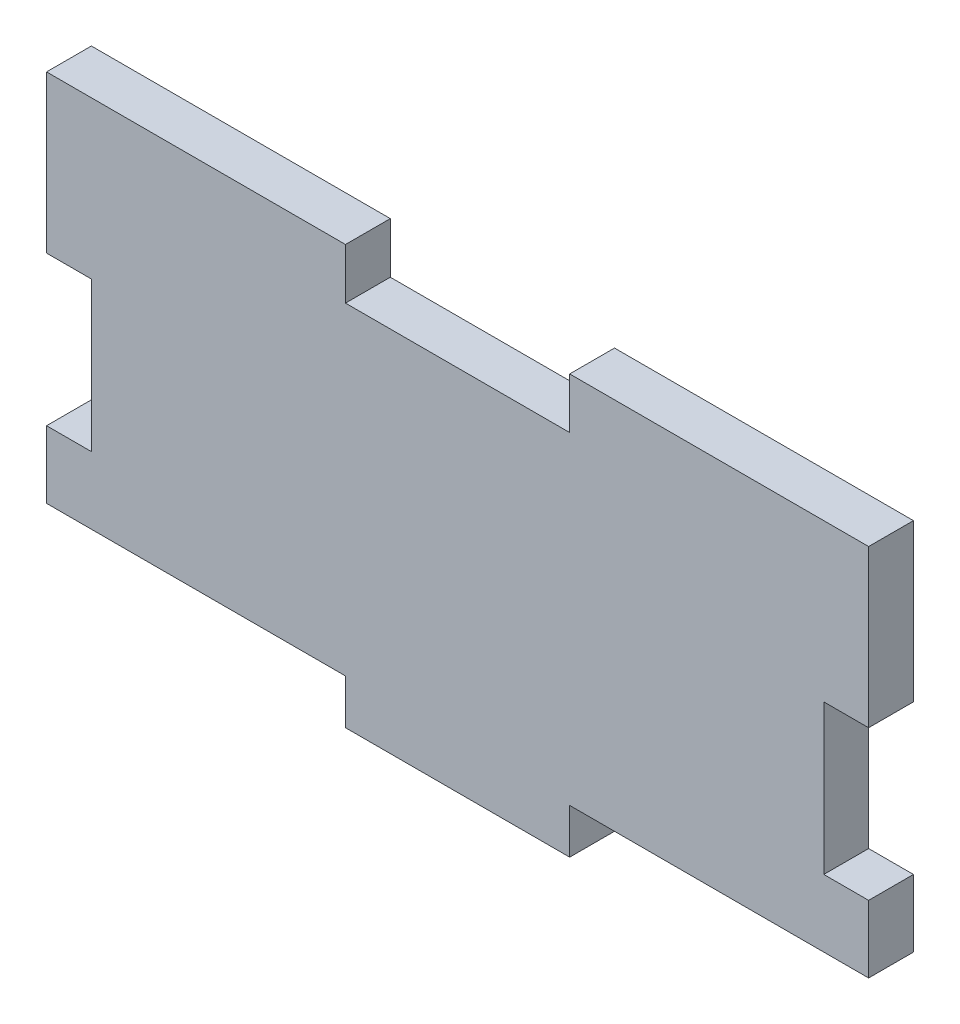
ISO-10303-21;
HEADER;
FILE_DESCRIPTION(('STEP AP214'),'2;1');
FILE_NAME('part.step','',(''),(''),'','','');
FILE_SCHEMA(('AUTOMOTIVE_DESIGN { 1 0 10303 214 1 1 1 1 }'));
ENDSEC;
DATA;
#1=APPLICATION_CONTEXT('core data for automotive mechanical design processes');
#2=APPLICATION_PROTOCOL_DEFINITION('international standard','automotive_design',2000,#1);
#3=PRODUCT_CONTEXT('',#1,'mechanical');
#4=PRODUCT('Part','Part','',(#3));
#5=PRODUCT_RELATED_PRODUCT_CATEGORY('part','',(#4));
#6=PRODUCT_DEFINITION_FORMATION('','',#4);
#7=PRODUCT_DEFINITION_CONTEXT('part definition',#1,'design');
#8=PRODUCT_DEFINITION('design','',#6,#7);
#9=PRODUCT_DEFINITION_SHAPE('','',#8);
#10=(LENGTH_UNIT() NAMED_UNIT(*) SI_UNIT(.MILLI.,.METRE.));
#11=(NAMED_UNIT(*) PLANE_ANGLE_UNIT() SI_UNIT($,.RADIAN.));
#12=(NAMED_UNIT(*) SI_UNIT($,.STERADIAN.) SOLID_ANGLE_UNIT());
#13=UNCERTAINTY_MEASURE_WITH_UNIT(LENGTH_MEASURE(1.E-05),#10,'distance_accuracy_value','');
#14=(GEOMETRIC_REPRESENTATION_CONTEXT(3) GLOBAL_UNCERTAINTY_ASSIGNED_CONTEXT((#13)) GLOBAL_UNIT_ASSIGNED_CONTEXT((#10,
#11,#12)) REPRESENTATION_CONTEXT('',''));
#15=CARTESIAN_POINT('',(0.,0.,0.));
#16=DIRECTION('',(0.,0.,1.));
#17=DIRECTION('',(1.,0.,0.));
#18=AXIS2_PLACEMENT_3D('',#15,#16,#17);
#19=CARTESIAN_POINT('',(0.,0.,-226.));
#20=DIRECTION('',(0.,1.,0.));
#21=DIRECTION('',(0.,0.,1.));
#22=AXIS2_PLACEMENT_3D('',#19,#20,#21);
#23=PLANE('',#22);
#24=DIRECTION('',(-1.,0.,0.));
#25=VECTOR('',#24,1.);
#26=CARTESIAN_POINT('',(0.,0.,-223.));
#27=LINE('',#26,#25);
#28=CARTESIAN_POINT('',(7.5,0.,-223.));
#29=VERTEX_POINT('',#28);
#30=CARTESIAN_POINT('',(-7.5,0.,-223.));
#31=VERTEX_POINT('',#30);
#32=EDGE_CURVE('E120',#29,#31,#27,.T.);
#33=ORIENTED_EDGE('',*,*,#32,.T.);
#34=DIRECTION('',(0.,0.,1.));
#35=VECTOR('',#34,1.);
#36=CARTESIAN_POINT('',(-7.5,0.,-226.));
#37=LINE('',#36,#35);
#38=CARTESIAN_POINT('',(-7.5,0.,-226.));
#39=VERTEX_POINT('',#38);
#40=EDGE_CURVE('E11',#39,#31,#37,.T.);
#41=ORIENTED_EDGE('',*,*,#40,.F.);
#42=DIRECTION('',(-1.,0.,0.));
#43=VECTOR('',#42,1.);
#44=CARTESIAN_POINT('',(0.,0.,-226.));
#45=LINE('',#44,#43);
#46=CARTESIAN_POINT('',(7.5,0.,-226.));
#47=VERTEX_POINT('',#46);
#48=EDGE_CURVE('E126',#47,#39,#45,.T.);
#49=ORIENTED_EDGE('',*,*,#48,.F.);
#50=DIRECTION('',(0.,0.,1.));
#51=VECTOR('',#50,1.);
#52=CARTESIAN_POINT('',(7.5,0.,-226.));
#53=LINE('',#52,#51);
#54=EDGE_CURVE('E196',#47,#29,#53,.T.);
#55=ORIENTED_EDGE('',*,*,#54,.T.);
#56=EDGE_LOOP('',(#33,#41,#49,#55));
#57=FACE_BOUND('',#56,.T.);
#58=ADVANCED_FACE('F32',(#57),#23,.F.);
#59=CARTESIAN_POINT('',(-7.5,0.,-226.));
#60=DIRECTION('',(1.,0.,0.));
#61=DIRECTION('',(0.,0.,-1.));
#62=AXIS2_PLACEMENT_3D('',#59,#60,#61);
#63=PLANE('',#62);
#64=DIRECTION('',(0.,1.,0.));
#65=VECTOR('',#64,1.);
#66=CARTESIAN_POINT('',(-7.5,0.,-223.));
#67=LINE('',#66,#65);
#68=CARTESIAN_POINT('',(-7.5,3.,-223.));
#69=VERTEX_POINT('',#68);
#70=EDGE_CURVE('E201',#31,#69,#67,.T.);
#71=ORIENTED_EDGE('',*,*,#70,.T.);
#72=DIRECTION('',(0.,0.,1.));
#73=VECTOR('',#72,1.);
#74=CARTESIAN_POINT('',(-7.5,3.,-226.));
#75=LINE('',#74,#73);
#76=CARTESIAN_POINT('',(-7.5,3.,-226.));
#77=VERTEX_POINT('',#76);
#78=EDGE_CURVE('E40',#77,#69,#75,.T.);
#79=ORIENTED_EDGE('',*,*,#78,.F.);
#80=DIRECTION('',(0.,1.,0.));
#81=VECTOR('',#80,1.);
#82=CARTESIAN_POINT('',(-7.5,0.,-226.));
#83=LINE('',#82,#81);
#84=EDGE_CURVE('E294',#39,#77,#83,.T.);
#85=ORIENTED_EDGE('',*,*,#84,.F.);
#86=ORIENTED_EDGE('',*,*,#40,.T.);
#87=EDGE_LOOP('',(#71,#79,#85,#86));
#88=FACE_BOUND('',#87,.T.);
#89=ADVANCED_FACE('F293',(#88),#63,.F.);
#90=CARTESIAN_POINT('',(-24.5,3.,-226.));
#91=DIRECTION('',(0.,1.,0.));
#92=DIRECTION('',(0.,0.,1.));
#93=AXIS2_PLACEMENT_3D('',#90,#91,#92);
#94=PLANE('',#93);
#95=DIRECTION('',(-1.,0.,0.));
#96=VECTOR('',#95,1.);
#97=CARTESIAN_POINT('',(-24.5,3.,-223.));
#98=LINE('',#97,#96);
#99=CARTESIAN_POINT('',(-27.5,3.,-223.));
#100=VERTEX_POINT('',#99);
#101=EDGE_CURVE('E204',#69,#100,#98,.T.);
#102=ORIENTED_EDGE('',*,*,#101,.T.);
#103=DIRECTION('',(0.,0.,1.));
#104=VECTOR('',#103,1.);
#105=CARTESIAN_POINT('',(-27.5,3.,-226.));
#106=LINE('',#105,#104);
#107=CARTESIAN_POINT('',(-27.5,3.,-226.));
#108=VERTEX_POINT('',#107);
#109=EDGE_CURVE('E282',#108,#100,#106,.T.);
#110=ORIENTED_EDGE('',*,*,#109,.F.);
#111=DIRECTION('',(-1.,0.,0.));
#112=VECTOR('',#111,1.);
#113=CARTESIAN_POINT('',(-7.5,3.,-226.));
#114=LINE('',#113,#112);
#115=EDGE_CURVE('E290',#77,#108,#114,.T.);
#116=ORIENTED_EDGE('',*,*,#115,.F.);
#117=ORIENTED_EDGE('',*,*,#78,.T.);
#118=EDGE_LOOP('',(#102,#110,#116,#117));
#119=FACE_BOUND('',#118,.T.);
#120=ADVANCED_FACE('F288',(#119),#94,.F.);
#121=CARTESIAN_POINT('',(-27.5,3.,-226.));
#122=DIRECTION('',(1.,0.,0.));
#123=DIRECTION('',(0.,0.,-1.));
#124=AXIS2_PLACEMENT_3D('',#121,#122,#123);
#125=PLANE('',#124);
#126=DIRECTION('',(0.,1.,0.));
#127=VECTOR('',#126,1.);
#128=CARTESIAN_POINT('',(-27.5,3.,-223.));
#129=LINE('',#128,#127);
#130=CARTESIAN_POINT('',(-27.5,7.5,-223.));
#131=VERTEX_POINT('',#130);
#132=EDGE_CURVE('E206',#100,#131,#129,.T.);
#133=ORIENTED_EDGE('',*,*,#132,.T.);
#134=DIRECTION('',(0.,0.,1.));
#135=VECTOR('',#134,1.);
#136=CARTESIAN_POINT('',(-27.5,7.5,-226.));
#137=LINE('',#136,#135);
#138=CARTESIAN_POINT('',(-27.5,7.5,-226.));
#139=VERTEX_POINT('',#138);
#140=EDGE_CURVE('E279',#139,#131,#137,.T.);
#141=ORIENTED_EDGE('',*,*,#140,.F.);
#142=DIRECTION('',(0.,1.,0.));
#143=VECTOR('',#142,1.);
#144=CARTESIAN_POINT('',(-27.5,3.,-226.));
#145=LINE('',#144,#143);
#146=EDGE_CURVE('E310',#108,#139,#145,.T.);
#147=ORIENTED_EDGE('',*,*,#146,.F.);
#148=ORIENTED_EDGE('',*,*,#109,.T.);
#149=EDGE_LOOP('',(#133,#141,#147,#148));
#150=FACE_BOUND('',#149,.T.);
#151=ADVANCED_FACE('F301',(#150),#125,.F.);
#152=CARTESIAN_POINT('',(-24.5,7.5,-226.));
#153=DIRECTION('',(0.,-1.,0.));
#154=DIRECTION('',(0.,0.,-1.));
#155=AXIS2_PLACEMENT_3D('',#152,#153,#154);
#156=PLANE('',#155);
#157=DIRECTION('',(1.,0.,0.));
#158=VECTOR('',#157,1.);
#159=CARTESIAN_POINT('',(-24.5,7.5,-223.));
#160=LINE('',#159,#158);
#161=CARTESIAN_POINT('',(-24.5,7.5,-223.));
#162=VERTEX_POINT('',#161);
#163=EDGE_CURVE('E208',#131,#162,#160,.T.);
#164=ORIENTED_EDGE('',*,*,#163,.T.);
#165=DIRECTION('',(0.,0.,1.));
#166=VECTOR('',#165,1.);
#167=CARTESIAN_POINT('',(-24.5,7.5,-226.));
#168=LINE('',#167,#166);
#169=CARTESIAN_POINT('',(-24.5,7.5,-226.));
#170=VERTEX_POINT('',#169);
#171=EDGE_CURVE('E276',#170,#162,#168,.T.);
#172=ORIENTED_EDGE('',*,*,#171,.F.);
#173=DIRECTION('',(1.,0.,0.));
#174=VECTOR('',#173,1.);
#175=CARTESIAN_POINT('',(-24.5,7.5,-226.));
#176=LINE('',#175,#174);
#177=EDGE_CURVE('E307',#139,#170,#176,.T.);
#178=ORIENTED_EDGE('',*,*,#177,.F.);
#179=ORIENTED_EDGE('',*,*,#140,.T.);
#180=EDGE_LOOP('',(#164,#172,#178,#179));
#181=FACE_BOUND('',#180,.T.);
#182=ADVANCED_FACE('F305',(#181),#156,.F.);
#183=CARTESIAN_POINT('',(-24.5,17.5,-226.));
#184=DIRECTION('',(1.,0.,0.));
#185=DIRECTION('',(0.,0.,-1.));
#186=AXIS2_PLACEMENT_3D('',#183,#184,#185);
#187=PLANE('',#186);
#188=DIRECTION('',(0.,1.,0.));
#189=VECTOR('',#188,1.);
#190=CARTESIAN_POINT('',(-24.5,17.5,-223.));
#191=LINE('',#190,#189);
#192=CARTESIAN_POINT('',(-24.5,17.5,-223.));
#193=VERTEX_POINT('',#192);
#194=EDGE_CURVE('E210',#162,#193,#191,.T.);
#195=ORIENTED_EDGE('',*,*,#194,.T.);
#196=DIRECTION('',(0.,0.,1.));
#197=VECTOR('',#196,1.);
#198=CARTESIAN_POINT('',(-24.5,17.5,-226.));
#199=LINE('',#198,#197);
#200=CARTESIAN_POINT('',(-24.5,17.5,-226.));
#201=VERTEX_POINT('',#200);
#202=EDGE_CURVE('E273',#201,#193,#199,.T.);
#203=ORIENTED_EDGE('',*,*,#202,.F.);
#204=DIRECTION('',(0.,1.,0.));
#205=VECTOR('',#204,1.);
#206=CARTESIAN_POINT('',(-24.5,17.5,-226.));
#207=LINE('',#206,#205);
#208=EDGE_CURVE('E309',#170,#201,#207,.T.);
#209=ORIENTED_EDGE('',*,*,#208,.F.);
#210=ORIENTED_EDGE('',*,*,#171,.T.);
#211=EDGE_LOOP('',(#195,#203,#209,#210));
#212=FACE_BOUND('',#211,.T.);
#213=ADVANCED_FACE('F363',(#212),#187,.F.);
#214=CARTESIAN_POINT('',(-27.5,17.5,-226.));
#215=DIRECTION('',(0.,1.,0.));
#216=DIRECTION('',(0.,0.,1.));
#217=AXIS2_PLACEMENT_3D('',#214,#215,#216);
#218=PLANE('',#217);
#219=DIRECTION('',(-1.,0.,0.));
#220=VECTOR('',#219,1.);
#221=CARTESIAN_POINT('',(-27.5,17.5,-223.));
#222=LINE('',#221,#220);
#223=CARTESIAN_POINT('',(-27.5,17.5,-223.));
#224=VERTEX_POINT('',#223);
#225=EDGE_CURVE('E212',#193,#224,#222,.T.);
#226=ORIENTED_EDGE('',*,*,#225,.T.);
#227=DIRECTION('',(0.,0.,1.));
#228=VECTOR('',#227,1.);
#229=CARTESIAN_POINT('',(-27.5,17.5,-226.));
#230=LINE('',#229,#228);
#231=CARTESIAN_POINT('',(-27.5,17.5,-226.));
#232=VERTEX_POINT('',#231);
#233=EDGE_CURVE('E270',#232,#224,#230,.T.);
#234=ORIENTED_EDGE('',*,*,#233,.F.);
#235=DIRECTION('',(-1.,0.,0.));
#236=VECTOR('',#235,1.);
#237=CARTESIAN_POINT('',(-27.5,17.5,-226.));
#238=LINE('',#237,#236);
#239=EDGE_CURVE('E312',#201,#232,#238,.T.);
#240=ORIENTED_EDGE('',*,*,#239,.F.);
#241=ORIENTED_EDGE('',*,*,#202,.T.);
#242=EDGE_LOOP('',(#226,#234,#240,#241));
#243=FACE_BOUND('',#242,.T.);
#244=ADVANCED_FACE('F366',(#243),#218,.F.);
#245=CARTESIAN_POINT('',(-27.5,28.,-226.));
#246=DIRECTION('',(1.,0.,0.));
#247=DIRECTION('',(0.,0.,-1.));
#248=AXIS2_PLACEMENT_3D('',#245,#246,#247);
#249=PLANE('',#248);
#250=DIRECTION('',(0.,1.,0.));
#251=VECTOR('',#250,1.);
#252=CARTESIAN_POINT('',(-27.5,28.,-223.));
#253=LINE('',#252,#251);
#254=CARTESIAN_POINT('',(-27.5,28.,-223.));
#255=VERTEX_POINT('',#254);
#256=EDGE_CURVE('E214',#224,#255,#253,.T.);
#257=ORIENTED_EDGE('',*,*,#256,.T.);
#258=DIRECTION('',(0.,0.,1.));
#259=VECTOR('',#258,1.);
#260=CARTESIAN_POINT('',(-27.5,28.,-226.));
#261=LINE('',#260,#259);
#262=CARTESIAN_POINT('',(-27.5,28.,-226.));
#263=VERTEX_POINT('',#262);
#264=EDGE_CURVE('E267',#263,#255,#261,.T.);
#265=ORIENTED_EDGE('',*,*,#264,.F.);
#266=DIRECTION('',(0.,1.,0.));
#267=VECTOR('',#266,1.);
#268=CARTESIAN_POINT('',(-27.5,28.,-226.));
#269=LINE('',#268,#267);
#270=EDGE_CURVE('E318',#232,#263,#269,.T.);
#271=ORIENTED_EDGE('',*,*,#270,.F.);
#272=ORIENTED_EDGE('',*,*,#233,.T.);
#273=EDGE_LOOP('',(#257,#265,#271,#272));
#274=FACE_BOUND('',#273,.T.);
#275=ADVANCED_FACE('F370',(#274),#249,.F.);
#276=CARTESIAN_POINT('',(-7.5,28.,-226.));
#277=DIRECTION('',(0.,-1.,0.));
#278=DIRECTION('',(0.,0.,-1.));
#279=AXIS2_PLACEMENT_3D('',#276,#277,#278);
#280=PLANE('',#279);
#281=DIRECTION('',(1.,0.,0.));
#282=VECTOR('',#281,1.);
#283=CARTESIAN_POINT('',(-7.5,28.,-223.));
#284=LINE('',#283,#282);
#285=CARTESIAN_POINT('',(-7.5,28.,-223.));
#286=VERTEX_POINT('',#285);
#287=EDGE_CURVE('E217',#255,#286,#284,.T.);
#288=ORIENTED_EDGE('',*,*,#287,.T.);
#289=DIRECTION('',(0.,0.,1.));
#290=VECTOR('',#289,1.);
#291=CARTESIAN_POINT('',(-7.5,28.,-226.));
#292=LINE('',#291,#290);
#293=CARTESIAN_POINT('',(-7.5,28.,-226.));
#294=VERTEX_POINT('',#293);
#295=EDGE_CURVE('E264',#294,#286,#292,.T.);
#296=ORIENTED_EDGE('',*,*,#295,.F.);
#297=DIRECTION('',(1.,0.,0.));
#298=VECTOR('',#297,1.);
#299=CARTESIAN_POINT('',(-24.5,28.,-226.));
#300=LINE('',#299,#298);
#301=EDGE_CURVE('E320',#263,#294,#300,.T.);
#302=ORIENTED_EDGE('',*,*,#301,.F.);
#303=ORIENTED_EDGE('',*,*,#264,.T.);
#304=EDGE_LOOP('',(#288,#296,#302,#303));
#305=FACE_BOUND('',#304,.T.);
#306=ADVANCED_FACE('F374',(#305),#280,.F.);
#307=CARTESIAN_POINT('',(-7.5,28.,-226.));
#308=DIRECTION('',(-1.,0.,0.));
#309=DIRECTION('',(0.,0.,1.));
#310=AXIS2_PLACEMENT_3D('',#307,#308,#309);
#311=PLANE('',#310);
#312=DIRECTION('',(0.,-1.,0.));
#313=VECTOR('',#312,1.);
#314=CARTESIAN_POINT('',(-7.5,28.,-223.));
#315=LINE('',#314,#313);
#316=CARTESIAN_POINT('',(-7.5,24.6030038239068,-223.));
#317=VERTEX_POINT('',#316);
#318=EDGE_CURVE('E219',#286,#317,#315,.T.);
#319=ORIENTED_EDGE('',*,*,#318,.T.);
#320=DIRECTION('',(0.,0.,1.));
#321=VECTOR('',#320,1.);
#322=CARTESIAN_POINT('',(-7.5,24.6030038239068,-226.));
#323=LINE('',#322,#321);
#324=CARTESIAN_POINT('',(-7.5,24.6030038239068,-226.));
#325=VERTEX_POINT('',#324);
#326=EDGE_CURVE('E261',#325,#317,#323,.T.);
#327=ORIENTED_EDGE('',*,*,#326,.F.);
#328=DIRECTION('',(0.,-1.,0.));
#329=VECTOR('',#328,1.);
#330=CARTESIAN_POINT('',(-7.5,28.,-226.));
#331=LINE('',#330,#329);
#332=EDGE_CURVE('E322',#294,#325,#331,.T.);
#333=ORIENTED_EDGE('',*,*,#332,.F.);
#334=ORIENTED_EDGE('',*,*,#295,.T.);
#335=EDGE_LOOP('',(#319,#327,#333,#334));
#336=FACE_BOUND('',#335,.T.);
#337=ADVANCED_FACE('F378',(#336),#311,.F.);
#338=CARTESIAN_POINT('',(-7.5,24.6030038239068,-226.));
#339=DIRECTION('',(0.,-1.,0.));
#340=DIRECTION('',(1.,0.,0.));
#341=AXIS2_PLACEMENT_3D('',#338,#339,#340);
#342=PLANE('',#341);
#343=DIRECTION('',(1.,0.,0.));
#344=VECTOR('',#343,1.);
#345=CARTESIAN_POINT('',(-7.5,24.6030038239068,-223.));
#346=LINE('',#345,#344);
#347=CARTESIAN_POINT('',(7.5,24.6030038239068,-223.));
#348=VERTEX_POINT('',#347);
#349=EDGE_CURVE('E221',#317,#348,#346,.T.);
#350=ORIENTED_EDGE('',*,*,#349,.T.);
#351=DIRECTION('',(0.,0.,1.));
#352=VECTOR('',#351,1.);
#353=CARTESIAN_POINT('',(7.5,24.6030038239068,-226.));
#354=LINE('',#353,#352);
#355=CARTESIAN_POINT('',(7.5,24.6030038239068,-226.));
#356=VERTEX_POINT('',#355);
#357=EDGE_CURVE('E258',#356,#348,#354,.T.);
#358=ORIENTED_EDGE('',*,*,#357,.F.);
#359=DIRECTION('',(1.,0.,0.));
#360=VECTOR('',#359,1.);
#361=CARTESIAN_POINT('',(-7.5,24.6030038239068,-226.));
#362=LINE('',#361,#360);
#363=EDGE_CURVE('E324',#325,#356,#362,.T.);
#364=ORIENTED_EDGE('',*,*,#363,.F.);
#365=ORIENTED_EDGE('',*,*,#326,.T.);
#366=EDGE_LOOP('',(#350,#358,#364,#365));
#367=FACE_BOUND('',#366,.T.);
#368=ADVANCED_FACE('F382',(#367),#342,.F.);
#369=CARTESIAN_POINT('',(7.5,24.6030038239068,-226.));
#370=DIRECTION('',(1.,0.,0.));
#371=DIRECTION('',(0.,0.,-1.));
#372=AXIS2_PLACEMENT_3D('',#369,#370,#371);
#373=PLANE('',#372);
#374=DIRECTION('',(0.,1.,0.));
#375=VECTOR('',#374,1.);
#376=CARTESIAN_POINT('',(7.5,24.6030038239068,-223.));
#377=LINE('',#376,#375);
#378=CARTESIAN_POINT('',(7.5,28.,-223.));
#379=VERTEX_POINT('',#378);
#380=EDGE_CURVE('E223',#348,#379,#377,.T.);
#381=ORIENTED_EDGE('',*,*,#380,.T.);
#382=DIRECTION('',(0.,0.,1.));
#383=VECTOR('',#382,1.);
#384=CARTESIAN_POINT('',(7.5,28.,-226.));
#385=LINE('',#384,#383);
#386=CARTESIAN_POINT('',(7.5,28.,-226.));
#387=VERTEX_POINT('',#386);
#388=EDGE_CURVE('E255',#387,#379,#385,.T.);
#389=ORIENTED_EDGE('',*,*,#388,.F.);
#390=DIRECTION('',(0.,1.,0.));
#391=VECTOR('',#390,1.);
#392=CARTESIAN_POINT('',(7.5,24.6030038239068,-226.));
#393=LINE('',#392,#391);
#394=EDGE_CURVE('E326',#356,#387,#393,.T.);
#395=ORIENTED_EDGE('',*,*,#394,.F.);
#396=ORIENTED_EDGE('',*,*,#357,.T.);
#397=EDGE_LOOP('',(#381,#389,#395,#396));
#398=FACE_BOUND('',#397,.T.);
#399=ADVANCED_FACE('F386',(#398),#373,.F.);
#400=CARTESIAN_POINT('',(7.5,28.,-226.));
#401=DIRECTION('',(0.,-1.,0.));
#402=DIRECTION('',(1.,0.,0.));
#403=AXIS2_PLACEMENT_3D('',#400,#401,#402);
#404=PLANE('',#403);
#405=DIRECTION('',(1.,0.,0.));
#406=VECTOR('',#405,1.);
#407=CARTESIAN_POINT('',(7.5,28.,-223.));
#408=LINE('',#407,#406);
#409=CARTESIAN_POINT('',(27.5,28.,-223.));
#410=VERTEX_POINT('',#409);
#411=EDGE_CURVE('E225',#379,#410,#408,.T.);
#412=ORIENTED_EDGE('',*,*,#411,.T.);
#413=DIRECTION('',(0.,0.,1.));
#414=VECTOR('',#413,1.);
#415=CARTESIAN_POINT('',(27.5,28.,-226.));
#416=LINE('',#415,#414);
#417=CARTESIAN_POINT('',(27.5,28.,-226.));
#418=VERTEX_POINT('',#417);
#419=EDGE_CURVE('E252',#418,#410,#416,.T.);
#420=ORIENTED_EDGE('',*,*,#419,.F.);
#421=DIRECTION('',(1.,0.,0.));
#422=VECTOR('',#421,1.);
#423=CARTESIAN_POINT('',(7.5,28.,-226.));
#424=LINE('',#423,#422);
#425=EDGE_CURVE('E328',#387,#418,#424,.T.);
#426=ORIENTED_EDGE('',*,*,#425,.F.);
#427=ORIENTED_EDGE('',*,*,#388,.T.);
#428=EDGE_LOOP('',(#412,#420,#426,#427));
#429=FACE_BOUND('',#428,.T.);
#430=ADVANCED_FACE('F390',(#429),#404,.F.);
#431=CARTESIAN_POINT('',(27.5,28.,-226.));
#432=DIRECTION('',(-1.,0.,0.));
#433=DIRECTION('',(0.,0.,1.));
#434=AXIS2_PLACEMENT_3D('',#431,#432,#433);
#435=PLANE('',#434);
#436=DIRECTION('',(0.,-1.,0.));
#437=VECTOR('',#436,1.);
#438=CARTESIAN_POINT('',(27.5,28.,-223.));
#439=LINE('',#438,#437);
#440=CARTESIAN_POINT('',(27.5,17.5,-223.));
#441=VERTEX_POINT('',#440);
#442=EDGE_CURVE('E227',#410,#441,#439,.T.);
#443=ORIENTED_EDGE('',*,*,#442,.T.);
#444=DIRECTION('',(0.,0.,1.));
#445=VECTOR('',#444,1.);
#446=CARTESIAN_POINT('',(27.5,17.5,-226.));
#447=LINE('',#446,#445);
#448=CARTESIAN_POINT('',(27.5,17.5,-226.));
#449=VERTEX_POINT('',#448);
#450=EDGE_CURVE('E249',#449,#441,#447,.T.);
#451=ORIENTED_EDGE('',*,*,#450,.F.);
#452=DIRECTION('',(0.,-1.,0.));
#453=VECTOR('',#452,1.);
#454=CARTESIAN_POINT('',(27.5,28.,-226.));
#455=LINE('',#454,#453);
#456=EDGE_CURVE('E330',#418,#449,#455,.T.);
#457=ORIENTED_EDGE('',*,*,#456,.F.);
#458=ORIENTED_EDGE('',*,*,#419,.T.);
#459=EDGE_LOOP('',(#443,#451,#457,#458));
#460=FACE_BOUND('',#459,.T.);
#461=ADVANCED_FACE('F394',(#460),#435,.F.);
#462=CARTESIAN_POINT('',(27.5,17.5,-226.));
#463=DIRECTION('',(0.,1.,0.));
#464=DIRECTION('',(0.,0.,1.));
#465=AXIS2_PLACEMENT_3D('',#462,#463,#464);
#466=PLANE('',#465);
#467=DIRECTION('',(-1.,0.,0.));
#468=VECTOR('',#467,1.);
#469=CARTESIAN_POINT('',(27.5,17.5,-223.));
#470=LINE('',#469,#468);
#471=CARTESIAN_POINT('',(24.5,17.5,-223.));
#472=VERTEX_POINT('',#471);
#473=EDGE_CURVE('E229',#441,#472,#470,.T.);
#474=ORIENTED_EDGE('',*,*,#473,.T.);
#475=DIRECTION('',(0.,0.,1.));
#476=VECTOR('',#475,1.);
#477=CARTESIAN_POINT('',(24.5,17.5,-226.));
#478=LINE('',#477,#476);
#479=CARTESIAN_POINT('',(24.5,17.5,-226.));
#480=VERTEX_POINT('',#479);
#481=EDGE_CURVE('E246',#480,#472,#478,.T.);
#482=ORIENTED_EDGE('',*,*,#481,.F.);
#483=DIRECTION('',(-1.,0.,0.));
#484=VECTOR('',#483,1.);
#485=CARTESIAN_POINT('',(27.5,17.5,-226.));
#486=LINE('',#485,#484);
#487=EDGE_CURVE('E332',#449,#480,#486,.T.);
#488=ORIENTED_EDGE('',*,*,#487,.F.);
#489=ORIENTED_EDGE('',*,*,#450,.T.);
#490=EDGE_LOOP('',(#474,#482,#488,#489));
#491=FACE_BOUND('',#490,.T.);
#492=ADVANCED_FACE('F398',(#491),#466,.F.);
#493=CARTESIAN_POINT('',(24.5,17.5,-226.));
#494=DIRECTION('',(-1.,0.,0.));
#495=DIRECTION('',(0.,0.,1.));
#496=AXIS2_PLACEMENT_3D('',#493,#494,#495);
#497=PLANE('',#496);
#498=DIRECTION('',(0.,-1.,0.));
#499=VECTOR('',#498,1.);
#500=CARTESIAN_POINT('',(24.5,17.5,-223.));
#501=LINE('',#500,#499);
#502=CARTESIAN_POINT('',(24.5,7.5,-223.));
#503=VERTEX_POINT('',#502);
#504=EDGE_CURVE('E231',#472,#503,#501,.T.);
#505=ORIENTED_EDGE('',*,*,#504,.T.);
#506=DIRECTION('',(0.,0.,1.));
#507=VECTOR('',#506,1.);
#508=CARTESIAN_POINT('',(24.5,7.5,-226.));
#509=LINE('',#508,#507);
#510=CARTESIAN_POINT('',(24.5,7.5,-226.));
#511=VERTEX_POINT('',#510);
#512=EDGE_CURVE('E243',#511,#503,#509,.T.);
#513=ORIENTED_EDGE('',*,*,#512,.F.);
#514=DIRECTION('',(0.,-1.,0.));
#515=VECTOR('',#514,1.);
#516=CARTESIAN_POINT('',(24.5,17.5,-226.));
#517=LINE('',#516,#515);
#518=EDGE_CURVE('E334',#480,#511,#517,.T.);
#519=ORIENTED_EDGE('',*,*,#518,.F.);
#520=ORIENTED_EDGE('',*,*,#481,.T.);
#521=EDGE_LOOP('',(#505,#513,#519,#520));
#522=FACE_BOUND('',#521,.T.);
#523=ADVANCED_FACE('F340',(#522),#497,.F.);
#524=CARTESIAN_POINT('',(24.5,7.5,-226.));
#525=DIRECTION('',(0.,-1.,0.));
#526=DIRECTION('',(1.,0.,0.));
#527=AXIS2_PLACEMENT_3D('',#524,#525,#526);
#528=PLANE('',#527);
#529=DIRECTION('',(1.,0.,0.));
#530=VECTOR('',#529,1.);
#531=CARTESIAN_POINT('',(24.5,7.5,-223.));
#532=LINE('',#531,#530);
#533=CARTESIAN_POINT('',(27.5,7.5,-223.));
#534=VERTEX_POINT('',#533);
#535=EDGE_CURVE('E233',#503,#534,#532,.T.);
#536=ORIENTED_EDGE('',*,*,#535,.T.);
#537=DIRECTION('',(0.,0.,1.));
#538=VECTOR('',#537,1.);
#539=CARTESIAN_POINT('',(27.5,7.5,-226.));
#540=LINE('',#539,#538);
#541=CARTESIAN_POINT('',(27.5,7.5,-226.));
#542=VERTEX_POINT('',#541);
#543=EDGE_CURVE('E191',#542,#534,#540,.T.);
#544=ORIENTED_EDGE('',*,*,#543,.F.);
#545=DIRECTION('',(1.,0.,0.));
#546=VECTOR('',#545,1.);
#547=CARTESIAN_POINT('',(24.5,7.5,-226.));
#548=LINE('',#547,#546);
#549=EDGE_CURVE('E182',#511,#542,#548,.T.);
#550=ORIENTED_EDGE('',*,*,#549,.F.);
#551=ORIENTED_EDGE('',*,*,#512,.T.);
#552=EDGE_LOOP('',(#536,#544,#550,#551));
#553=FACE_BOUND('',#552,.T.);
#554=ADVANCED_FACE('F344',(#553),#528,.F.);
#555=CARTESIAN_POINT('',(27.5,7.5,-226.));
#556=DIRECTION('',(-1.,0.,0.));
#557=DIRECTION('',(0.,-1.,0.));
#558=AXIS2_PLACEMENT_3D('',#555,#556,#557);
#559=PLANE('',#558);
#560=DIRECTION('',(0.,-1.,0.));
#561=VECTOR('',#560,1.);
#562=CARTESIAN_POINT('',(27.5,7.5,-223.));
#563=LINE('',#562,#561);
#564=CARTESIAN_POINT('',(27.5,3.,-223.));
#565=VERTEX_POINT('',#564);
#566=EDGE_CURVE('E190',#534,#565,#563,.T.);
#567=ORIENTED_EDGE('',*,*,#566,.T.);
#568=DIRECTION('',(0.,0.,1.));
#569=VECTOR('',#568,1.);
#570=CARTESIAN_POINT('',(27.5,3.,-226.));
#571=LINE('',#570,#569);
#572=CARTESIAN_POINT('',(27.5,3.,-226.));
#573=VERTEX_POINT('',#572);
#574=EDGE_CURVE('E187',#573,#565,#571,.T.);
#575=ORIENTED_EDGE('',*,*,#574,.F.);
#576=DIRECTION('',(0.,-1.,0.));
#577=VECTOR('',#576,1.);
#578=CARTESIAN_POINT('',(27.5,7.5,-226.));
#579=LINE('',#578,#577);
#580=EDGE_CURVE('E176',#542,#573,#579,.T.);
#581=ORIENTED_EDGE('',*,*,#580,.F.);
#582=ORIENTED_EDGE('',*,*,#543,.T.);
#583=EDGE_LOOP('',(#567,#575,#581,#582));
#584=FACE_BOUND('',#583,.T.);
#585=ADVANCED_FACE('F188',(#584),#559,.F.);
#586=CARTESIAN_POINT('',(27.5,3.,-226.));
#587=DIRECTION('',(0.,1.,0.));
#588=DIRECTION('',(-1.,0.,0.));
#589=AXIS2_PLACEMENT_3D('',#586,#587,#588);
#590=PLANE('',#589);
#591=DIRECTION('',(-1.,0.,0.));
#592=VECTOR('',#591,1.);
#593=CARTESIAN_POINT('',(27.5,3.,-223.));
#594=LINE('',#593,#592);
#595=CARTESIAN_POINT('',(7.5,3.,-223.));
#596=VERTEX_POINT('',#595);
#597=EDGE_CURVE('E113',#565,#596,#594,.T.);
#598=ORIENTED_EDGE('',*,*,#597,.T.);
#599=DIRECTION('',(0.,0.,1.));
#600=VECTOR('',#599,1.);
#601=CARTESIAN_POINT('',(7.5,3.,-226.));
#602=LINE('',#601,#600);
#603=CARTESIAN_POINT('',(7.5,3.,-226.));
#604=VERTEX_POINT('',#603);
#605=EDGE_CURVE('E192',#604,#596,#602,.T.);
#606=ORIENTED_EDGE('',*,*,#605,.F.);
#607=DIRECTION('',(-1.,0.,0.));
#608=VECTOR('',#607,1.);
#609=CARTESIAN_POINT('',(27.5,3.,-226.));
#610=LINE('',#609,#608);
#611=EDGE_CURVE('E180',#573,#604,#610,.T.);
#612=ORIENTED_EDGE('',*,*,#611,.F.);
#613=ORIENTED_EDGE('',*,*,#574,.T.);
#614=EDGE_LOOP('',(#598,#606,#612,#613));
#615=FACE_BOUND('',#614,.T.);
#616=ADVANCED_FACE('F194',(#615),#590,.F.);
#617=CARTESIAN_POINT('',(7.5,3.,-226.));
#618=DIRECTION('',(-1.,0.,0.));
#619=DIRECTION('',(0.,-1.,0.));
#620=AXIS2_PLACEMENT_3D('',#617,#618,#619);
#621=PLANE('',#620);
#622=DIRECTION('',(0.,-1.,0.));
#623=VECTOR('',#622,1.);
#624=CARTESIAN_POINT('',(7.5,3.,-223.));
#625=LINE('',#624,#623);
#626=EDGE_CURVE('E237',#596,#29,#625,.T.);
#627=ORIENTED_EDGE('',*,*,#626,.T.);
#628=ORIENTED_EDGE('',*,*,#54,.F.);
#629=DIRECTION('',(0.,-1.,0.));
#630=VECTOR('',#629,1.);
#631=CARTESIAN_POINT('',(7.5,3.,-226.));
#632=LINE('',#631,#630);
#633=EDGE_CURVE('E48',#604,#47,#632,.T.);
#634=ORIENTED_EDGE('',*,*,#633,.F.);
#635=ORIENTED_EDGE('',*,*,#605,.T.);
#636=EDGE_LOOP('',(#627,#628,#634,#635));
#637=FACE_BOUND('',#636,.T.);
#638=ADVANCED_FACE('F346',(#637),#621,.F.);
#639=CARTESIAN_POINT('',(0.,0.,-226.));
#640=DIRECTION('',(0.,0.,-1.));
#641=DIRECTION('',(-1.,0.,0.));
#642=AXIS2_PLACEMENT_3D('',#639,#640,#641);
#643=PLANE('',#642);
#644=ORIENTED_EDGE('',*,*,#48,.T.);
#645=ORIENTED_EDGE('',*,*,#84,.T.);
#646=ORIENTED_EDGE('',*,*,#115,.T.);
#647=ORIENTED_EDGE('',*,*,#146,.T.);
#648=ORIENTED_EDGE('',*,*,#177,.T.);
#649=ORIENTED_EDGE('',*,*,#208,.T.);
#650=ORIENTED_EDGE('',*,*,#239,.T.);
#651=ORIENTED_EDGE('',*,*,#270,.T.);
#652=ORIENTED_EDGE('',*,*,#301,.T.);
#653=ORIENTED_EDGE('',*,*,#332,.T.);
#654=ORIENTED_EDGE('',*,*,#363,.T.);
#655=ORIENTED_EDGE('',*,*,#394,.T.);
#656=ORIENTED_EDGE('',*,*,#425,.T.);
#657=ORIENTED_EDGE('',*,*,#456,.T.);
#658=ORIENTED_EDGE('',*,*,#487,.T.);
#659=ORIENTED_EDGE('',*,*,#518,.T.);
#660=ORIENTED_EDGE('',*,*,#549,.T.);
#661=ORIENTED_EDGE('',*,*,#580,.T.);
#662=ORIENTED_EDGE('',*,*,#611,.T.);
#663=ORIENTED_EDGE('',*,*,#633,.T.);
#664=EDGE_LOOP('',(#644,#645,#646,#647,#648,#649,#650,#651,#652,#653,#654,#655,#656,#657,#658,
#659,#660,#661,#662,#663));
#665=FACE_BOUND('',#664,.T.);
#666=ADVANCED_FACE('F178',(#665),#643,.T.);
#667=CARTESIAN_POINT('',(0.,0.,-223.));
#668=DIRECTION('',(0.,0.,-1.));
#669=DIRECTION('',(-1.,0.,0.));
#670=AXIS2_PLACEMENT_3D('',#667,#668,#669);
#671=PLANE('',#670);
#672=ORIENTED_EDGE('',*,*,#32,.F.);
#673=ORIENTED_EDGE('',*,*,#626,.F.);
#674=ORIENTED_EDGE('',*,*,#597,.F.);
#675=ORIENTED_EDGE('',*,*,#566,.F.);
#676=ORIENTED_EDGE('',*,*,#535,.F.);
#677=ORIENTED_EDGE('',*,*,#504,.F.);
#678=ORIENTED_EDGE('',*,*,#473,.F.);
#679=ORIENTED_EDGE('',*,*,#442,.F.);
#680=ORIENTED_EDGE('',*,*,#411,.F.);
#681=ORIENTED_EDGE('',*,*,#380,.F.);
#682=ORIENTED_EDGE('',*,*,#349,.F.);
#683=ORIENTED_EDGE('',*,*,#318,.F.);
#684=ORIENTED_EDGE('',*,*,#287,.F.);
#685=ORIENTED_EDGE('',*,*,#256,.F.);
#686=ORIENTED_EDGE('',*,*,#225,.F.);
#687=ORIENTED_EDGE('',*,*,#194,.F.);
#688=ORIENTED_EDGE('',*,*,#163,.F.);
#689=ORIENTED_EDGE('',*,*,#132,.F.);
#690=ORIENTED_EDGE('',*,*,#101,.F.);
#691=ORIENTED_EDGE('',*,*,#70,.F.);
#692=EDGE_LOOP('',(#672,#673,#674,#675,#676,#677,#678,#679,#680,#681,#682,#683,#684,#685,#686,
#687,#688,#689,#690,#691));
#693=FACE_BOUND('',#692,.T.);
#694=ADVANCED_FACE('F295',(#693),#671,.F.);
#695=CLOSED_SHELL('',(#58,#89,#120,#151,#182,#213,#244,#275,#306,#337,#368,#399,#430,#461,#492,
#523,#554,#585,#616,#638,#666,#694));
#696=MANIFOLD_SOLID_BREP('B2',#695);
#697=ADVANCED_BREP_SHAPE_REPRESENTATION('',(#18,#696),#14);
#698=SHAPE_DEFINITION_REPRESENTATION(#9,#697);
ENDSEC;
END-ISO-10303-21;
